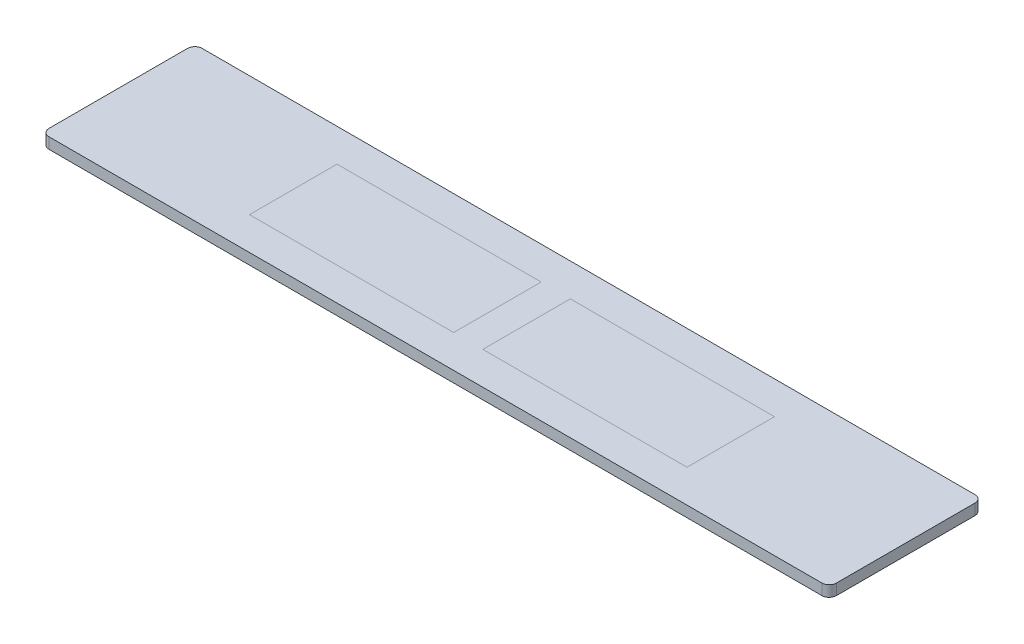
ISO-10303-21;
HEADER;
FILE_DESCRIPTION(('STEP AP214'),'2;1');
FILE_NAME('part.step','',(''),(''),'','','');
FILE_SCHEMA(('AUTOMOTIVE_DESIGN { 1 0 10303 214 1 1 1 1 }'));
ENDSEC;
DATA;
#1=APPLICATION_CONTEXT('core data for automotive mechanical design processes');
#2=APPLICATION_PROTOCOL_DEFINITION('international standard','automotive_design',2000,#1);
#3=PRODUCT_CONTEXT('',#1,'mechanical');
#4=PRODUCT('Part','Part','',(#3));
#5=PRODUCT_RELATED_PRODUCT_CATEGORY('part','',(#4));
#6=PRODUCT_DEFINITION_FORMATION('','',#4);
#7=PRODUCT_DEFINITION_CONTEXT('part definition',#1,'design');
#8=PRODUCT_DEFINITION('design','',#6,#7);
#9=PRODUCT_DEFINITION_SHAPE('','',#8);
#10=(LENGTH_UNIT() NAMED_UNIT(*) SI_UNIT(.MILLI.,.METRE.));
#11=(NAMED_UNIT(*) PLANE_ANGLE_UNIT() SI_UNIT($,.RADIAN.));
#12=(NAMED_UNIT(*) SI_UNIT($,.STERADIAN.) SOLID_ANGLE_UNIT());
#13=UNCERTAINTY_MEASURE_WITH_UNIT(LENGTH_MEASURE(1.E-05),#10,'distance_accuracy_value','');
#14=(GEOMETRIC_REPRESENTATION_CONTEXT(3) GLOBAL_UNCERTAINTY_ASSIGNED_CONTEXT((#13)) GLOBAL_UNIT_ASSIGNED_CONTEXT((#10,
#11,#12)) REPRESENTATION_CONTEXT('',''));
#15=CARTESIAN_POINT('',(0.,0.,0.));
#16=DIRECTION('',(0.,0.,1.));
#17=DIRECTION('',(1.,0.,0.));
#18=AXIS2_PLACEMENT_3D('',#15,#16,#17);
#19=CARTESIAN_POINT('',(0.,4.7625,0.));
#20=DIRECTION('',(0.,-1.,0.));
#21=DIRECTION('',(0.,0.,-1.));
#22=AXIS2_PLACEMENT_3D('',#19,#20,#21);
#23=PLANE('',#22);
#24=DIRECTION('',(0.,0.,-1.));
#25=VECTOR('',#24,1.);
#26=CARTESIAN_POINT('',(190.5,4.7625,0.));
#27=LINE('',#26,#25);
#28=CARTESIAN_POINT('',(190.5,4.7625,38.1));
#29=VERTEX_POINT('',#28);
#30=CARTESIAN_POINT('',(190.5,4.7625,-38.1));
#31=VERTEX_POINT('',#30);
#32=EDGE_CURVE('E204',#29,#31,#27,.T.);
#33=ORIENTED_EDGE('',*,*,#32,.F.);
#34=DIRECTION('',(1.,0.,0.));
#35=VECTOR('',#34,1.);
#36=CARTESIAN_POINT('',(0.,4.7625,38.1));
#37=LINE('',#36,#35);
#38=CARTESIAN_POINT('',(12.6999999999999,4.7625,38.1));
#39=VERTEX_POINT('',#38);
#40=EDGE_CURVE('E194',#39,#29,#37,.T.);
#41=ORIENTED_EDGE('',*,*,#40,.F.);
#42=DIRECTION('',(0.,0.,1.));
#43=VECTOR('',#42,1.);
#44=CARTESIAN_POINT('',(12.6999999999999,4.7625,0.));
#45=LINE('',#44,#43);
#46=CARTESIAN_POINT('',(12.6999999999999,4.7625,-38.1));
#47=VERTEX_POINT('',#46);
#48=EDGE_CURVE('E198',#47,#39,#45,.T.);
#49=ORIENTED_EDGE('',*,*,#48,.F.);
#50=DIRECTION('',(-1.,0.,0.));
#51=VECTOR('',#50,1.);
#52=CARTESIAN_POINT('',(0.,4.7625,-38.1));
#53=LINE('',#52,#51);
#54=EDGE_CURVE('E201',#31,#47,#53,.T.);
#55=ORIENTED_EDGE('',*,*,#54,.F.);
#56=EDGE_LOOP('',(#33,#41,#49,#55));
#57=FACE_BOUND('',#56,.T.);
#58=DIRECTION('',(0.,0.,-1.));
#59=VECTOR('',#58,1.);
#60=CARTESIAN_POINT('',(342.9,4.7625,66.675));
#61=LINE('',#60,#59);
#62=CARTESIAN_POINT('',(342.9,4.7625,60.325));
#63=VERTEX_POINT('',#62);
#64=CARTESIAN_POINT('',(342.9,4.7625,-60.325));
#65=VERTEX_POINT('',#64);
#66=EDGE_CURVE('E138',#63,#65,#61,.T.);
#67=ORIENTED_EDGE('',*,*,#66,.T.);
#68=CARTESIAN_POINT('',(336.55,4.7625,-60.325));
#69=DIRECTION('',(0.,-1.,0.));
#70=DIRECTION('',(0.,0.,-1.));
#71=AXIS2_PLACEMENT_3D('',#68,#69,#70);
#72=CIRCLE('',#71,6.35);
#73=CARTESIAN_POINT('',(336.55,4.7625,-66.675));
#74=VERTEX_POINT('',#73);
#75=EDGE_CURVE('E171',#65,#74,#72,.F.);
#76=ORIENTED_EDGE('',*,*,#75,.T.);
#77=DIRECTION('',(-1.,0.,0.));
#78=VECTOR('',#77,1.);
#79=CARTESIAN_POINT('',(-342.9,4.7625,-66.675));
#80=LINE('',#79,#78);
#81=CARTESIAN_POINT('',(-336.55,4.7625,-66.675));
#82=VERTEX_POINT('',#81);
#83=EDGE_CURVE('E155',#74,#82,#80,.T.);
#84=ORIENTED_EDGE('',*,*,#83,.T.);
#85=CARTESIAN_POINT('',(-336.55,4.7625,-60.325));
#86=DIRECTION('',(0.,-1.,0.));
#87=DIRECTION('',(0.,0.,-1.));
#88=AXIS2_PLACEMENT_3D('',#85,#86,#87);
#89=CIRCLE('',#88,6.35);
#90=CARTESIAN_POINT('',(-342.9,4.7625,-60.325));
#91=VERTEX_POINT('',#90);
#92=EDGE_CURVE('E169',#82,#91,#89,.F.);
#93=ORIENTED_EDGE('',*,*,#92,.T.);
#94=DIRECTION('',(0.,0.,1.));
#95=VECTOR('',#94,1.);
#96=CARTESIAN_POINT('',(-342.9,4.7625,66.675));
#97=LINE('',#96,#95);
#98=CARTESIAN_POINT('',(-342.9,4.7625,60.325));
#99=VERTEX_POINT('',#98);
#100=EDGE_CURVE('E219',#91,#99,#97,.T.);
#101=ORIENTED_EDGE('',*,*,#100,.T.);
#102=CARTESIAN_POINT('',(-336.55,4.7625,60.325));
#103=DIRECTION('',(0.,-1.,0.));
#104=DIRECTION('',(0.,0.,-1.));
#105=AXIS2_PLACEMENT_3D('',#102,#103,#104);
#106=CIRCLE('',#105,6.35);
#107=CARTESIAN_POINT('',(-336.55,4.7625,66.675));
#108=VERTEX_POINT('',#107);
#109=EDGE_CURVE('E145',#99,#108,#106,.F.);
#110=ORIENTED_EDGE('',*,*,#109,.T.);
#111=DIRECTION('',(1.,0.,0.));
#112=VECTOR('',#111,1.);
#113=CARTESIAN_POINT('',(-342.9,4.7625,66.675));
#114=LINE('',#113,#112);
#115=CARTESIAN_POINT('',(336.55,4.7625,66.675));
#116=VERTEX_POINT('',#115);
#117=EDGE_CURVE('E140',#108,#116,#114,.T.);
#118=ORIENTED_EDGE('',*,*,#117,.T.);
#119=CARTESIAN_POINT('',(336.55,4.7625,60.325));
#120=DIRECTION('',(0.,-1.,0.));
#121=DIRECTION('',(0.,0.,-1.));
#122=AXIS2_PLACEMENT_3D('',#119,#120,#121);
#123=CIRCLE('',#122,6.35);
#124=EDGE_CURVE('E135',#116,#63,#123,.F.);
#125=ORIENTED_EDGE('',*,*,#124,.T.);
#126=EDGE_LOOP('',(#67,#76,#84,#93,#101,#110,#118,#125));
#127=FACE_BOUND('',#126,.T.);
#128=DIRECTION('',(0.,0.,-1.));
#129=VECTOR('',#128,1.);
#130=CARTESIAN_POINT('',(-12.6999999999999,4.7625,0.));
#131=LINE('',#130,#129);
#132=CARTESIAN_POINT('',(-12.6999999999999,4.7625,38.1));
#133=VERTEX_POINT('',#132);
#134=CARTESIAN_POINT('',(-12.6999999999999,4.7625,-38.1));
#135=VERTEX_POINT('',#134);
#136=EDGE_CURVE('E11',#133,#135,#131,.T.);
#137=ORIENTED_EDGE('',*,*,#136,.F.);
#138=DIRECTION('',(1.,0.,0.));
#139=VECTOR('',#138,1.);
#140=CARTESIAN_POINT('',(0.,4.7625,38.1));
#141=LINE('',#140,#139);
#142=CARTESIAN_POINT('',(-190.5,4.7625,38.1));
#143=VERTEX_POINT('',#142);
#144=EDGE_CURVE('E207',#143,#133,#141,.T.);
#145=ORIENTED_EDGE('',*,*,#144,.F.);
#146=DIRECTION('',(0.,0.,1.));
#147=VECTOR('',#146,1.);
#148=CARTESIAN_POINT('',(-190.5,4.7625,0.));
#149=LINE('',#148,#147);
#150=CARTESIAN_POINT('',(-190.5,4.7625,-38.1));
#151=VERTEX_POINT('',#150);
#152=EDGE_CURVE('E210',#151,#143,#149,.T.);
#153=ORIENTED_EDGE('',*,*,#152,.F.);
#154=DIRECTION('',(-1.,0.,0.));
#155=VECTOR('',#154,1.);
#156=CARTESIAN_POINT('',(0.,4.7625,-38.1));
#157=LINE('',#156,#155);
#158=EDGE_CURVE('E59',#135,#151,#157,.T.);
#159=ORIENTED_EDGE('',*,*,#158,.F.);
#160=EDGE_LOOP('',(#137,#145,#153,#159));
#161=FACE_BOUND('',#160,.T.);
#162=ADVANCED_FACE('F50',(#57,#127,#161),#23,.F.);
#163=ORIENTED_EDGE('',*,*,#144,.T.);
#164=ORIENTED_EDGE('',*,*,#136,.T.);
#165=ORIENTED_EDGE('',*,*,#158,.T.);
#166=ORIENTED_EDGE('',*,*,#152,.T.);
#167=EDGE_LOOP('',(#163,#164,#165,#166));
#168=FACE_BOUND('',#167,.T.);
#169=ADVANCED_FACE('F266',(#168),#23,.F.);
#170=CARTESIAN_POINT('',(342.9,-4.7625,66.675));
#171=DIRECTION('',(1.,0.,0.));
#172=DIRECTION('',(0.,0.,-1.));
#173=AXIS2_PLACEMENT_3D('',#170,#171,#172);
#174=PLANE('',#173);
#175=DIRECTION('',(0.,0.,-1.));
#176=VECTOR('',#175,1.);
#177=CARTESIAN_POINT('',(342.9,-4.7625,66.675));
#178=LINE('',#177,#176);
#179=CARTESIAN_POINT('',(342.9,-4.7625,60.325));
#180=VERTEX_POINT('',#179);
#181=CARTESIAN_POINT('',(342.9,-4.7625,-60.325));
#182=VERTEX_POINT('',#181);
#183=EDGE_CURVE('E223',#180,#182,#178,.T.);
#184=ORIENTED_EDGE('',*,*,#183,.T.);
#185=DIRECTION('',(0.,1.,0.));
#186=VECTOR('',#185,1.);
#187=CARTESIAN_POINT('',(342.9,-4.7625,-60.325));
#188=LINE('',#187,#186);
#189=EDGE_CURVE('E146',#182,#65,#188,.T.);
#190=ORIENTED_EDGE('',*,*,#189,.T.);
#191=ORIENTED_EDGE('',*,*,#66,.F.);
#192=DIRECTION('',(0.,1.,0.));
#193=VECTOR('',#192,1.);
#194=CARTESIAN_POINT('',(342.9,-4.7625,60.325));
#195=LINE('',#194,#193);
#196=EDGE_CURVE('E152',#63,#180,#195,.F.);
#197=ORIENTED_EDGE('',*,*,#196,.T.);
#198=EDGE_LOOP('',(#184,#190,#191,#197));
#199=FACE_BOUND('',#198,.T.);
#200=ADVANCED_FACE('F151',(#199),#174,.T.);
#201=CARTESIAN_POINT('',(-342.9,-4.7625,66.675));
#202=DIRECTION('',(0.,0.,1.));
#203=DIRECTION('',(1.,0.,0.));
#204=AXIS2_PLACEMENT_3D('',#201,#202,#203);
#205=PLANE('',#204);
#206=ORIENTED_EDGE('',*,*,#117,.F.);
#207=DIRECTION('',(0.,1.,0.));
#208=VECTOR('',#207,1.);
#209=CARTESIAN_POINT('',(-336.55,-4.7625,66.675));
#210=LINE('',#209,#208);
#211=CARTESIAN_POINT('',(-336.55,-4.7625,66.675));
#212=VERTEX_POINT('',#211);
#213=EDGE_CURVE('E192',#108,#212,#210,.F.);
#214=ORIENTED_EDGE('',*,*,#213,.T.);
#215=DIRECTION('',(1.,0.,0.));
#216=VECTOR('',#215,1.);
#217=CARTESIAN_POINT('',(-342.9,-4.7625,66.675));
#218=LINE('',#217,#216);
#219=CARTESIAN_POINT('',(336.55,-4.7625,66.675));
#220=VERTEX_POINT('',#219);
#221=EDGE_CURVE('E159',#212,#220,#218,.T.);
#222=ORIENTED_EDGE('',*,*,#221,.T.);
#223=DIRECTION('',(0.,1.,0.));
#224=VECTOR('',#223,1.);
#225=CARTESIAN_POINT('',(336.55,-4.7625,66.675));
#226=LINE('',#225,#224);
#227=EDGE_CURVE('E190',#220,#116,#226,.T.);
#228=ORIENTED_EDGE('',*,*,#227,.T.);
#229=EDGE_LOOP('',(#206,#214,#222,#228));
#230=FACE_BOUND('',#229,.T.);
#231=ADVANCED_FACE('F250',(#230),#205,.T.);
#232=CARTESIAN_POINT('',(-342.9,-4.7625,66.675));
#233=DIRECTION('',(-1.,0.,0.));
#234=DIRECTION('',(0.,0.,1.));
#235=AXIS2_PLACEMENT_3D('',#232,#233,#234);
#236=PLANE('',#235);
#237=ORIENTED_EDGE('',*,*,#100,.F.);
#238=DIRECTION('',(0.,1.,0.));
#239=VECTOR('',#238,1.);
#240=CARTESIAN_POINT('',(-342.9,-4.7625,-60.325));
#241=LINE('',#240,#239);
#242=CARTESIAN_POINT('',(-342.9,-4.7625,-60.325));
#243=VERTEX_POINT('',#242);
#244=EDGE_CURVE('E188',#91,#243,#241,.F.);
#245=ORIENTED_EDGE('',*,*,#244,.T.);
#246=DIRECTION('',(0.,0.,1.));
#247=VECTOR('',#246,1.);
#248=CARTESIAN_POINT('',(-342.9,-4.7625,66.675));
#249=LINE('',#248,#247);
#250=CARTESIAN_POINT('',(-342.9,-4.7625,60.325));
#251=VERTEX_POINT('',#250);
#252=EDGE_CURVE('E163',#243,#251,#249,.T.);
#253=ORIENTED_EDGE('',*,*,#252,.T.);
#254=DIRECTION('',(0.,1.,0.));
#255=VECTOR('',#254,1.);
#256=CARTESIAN_POINT('',(-342.9,-4.7625,60.325));
#257=LINE('',#256,#255);
#258=EDGE_CURVE('E185',#251,#99,#257,.T.);
#259=ORIENTED_EDGE('',*,*,#258,.T.);
#260=EDGE_LOOP('',(#237,#245,#253,#259));
#261=FACE_BOUND('',#260,.T.);
#262=ADVANCED_FACE('F235',(#261),#236,.T.);
#263=CARTESIAN_POINT('',(-342.9,-4.7625,-66.675));
#264=DIRECTION('',(0.,0.,-1.));
#265=DIRECTION('',(-1.,0.,0.));
#266=AXIS2_PLACEMENT_3D('',#263,#264,#265);
#267=PLANE('',#266);
#268=ORIENTED_EDGE('',*,*,#83,.F.);
#269=DIRECTION('',(0.,1.,0.));
#270=VECTOR('',#269,1.);
#271=CARTESIAN_POINT('',(336.55,-4.7625,-66.675));
#272=LINE('',#271,#270);
#273=CARTESIAN_POINT('',(336.55,-4.7625,-66.675));
#274=VERTEX_POINT('',#273);
#275=EDGE_CURVE('E176',#74,#274,#272,.F.);
#276=ORIENTED_EDGE('',*,*,#275,.T.);
#277=DIRECTION('',(-1.,0.,0.));
#278=VECTOR('',#277,1.);
#279=CARTESIAN_POINT('',(-342.9,-4.7625,-66.675));
#280=LINE('',#279,#278);
#281=CARTESIAN_POINT('',(-336.55,-4.7625,-66.675));
#282=VERTEX_POINT('',#281);
#283=EDGE_CURVE('E221',#274,#282,#280,.T.);
#284=ORIENTED_EDGE('',*,*,#283,.T.);
#285=DIRECTION('',(0.,1.,0.));
#286=VECTOR('',#285,1.);
#287=CARTESIAN_POINT('',(-336.55,-4.7625,-66.675));
#288=LINE('',#287,#286);
#289=EDGE_CURVE('E173',#282,#82,#288,.T.);
#290=ORIENTED_EDGE('',*,*,#289,.T.);
#291=EDGE_LOOP('',(#268,#276,#284,#290));
#292=FACE_BOUND('',#291,.T.);
#293=ADVANCED_FACE('F255',(#292),#267,.T.);
#294=CARTESIAN_POINT('',(0.,-4.7625,0.));
#295=DIRECTION('',(0.,-1.,0.));
#296=DIRECTION('',(0.,0.,-1.));
#297=AXIS2_PLACEMENT_3D('',#294,#295,#296);
#298=PLANE('',#297);
#299=ORIENTED_EDGE('',*,*,#283,.F.);
#300=CARTESIAN_POINT('',(336.55,-4.7625,-60.325));
#301=DIRECTION('',(0.,-1.,0.));
#302=DIRECTION('',(0.,0.,-1.));
#303=AXIS2_PLACEMENT_3D('',#300,#301,#302);
#304=CIRCLE('',#303,6.35);
#305=EDGE_CURVE('E183',#274,#182,#304,.T.);
#306=ORIENTED_EDGE('',*,*,#305,.T.);
#307=ORIENTED_EDGE('',*,*,#183,.F.);
#308=CARTESIAN_POINT('',(336.55,-4.7625,60.325));
#309=DIRECTION('',(0.,-1.,0.));
#310=DIRECTION('',(0.,0.,-1.));
#311=AXIS2_PLACEMENT_3D('',#308,#309,#310);
#312=CIRCLE('',#311,6.35);
#313=EDGE_CURVE('E158',#180,#220,#312,.T.);
#314=ORIENTED_EDGE('',*,*,#313,.T.);
#315=ORIENTED_EDGE('',*,*,#221,.F.);
#316=CARTESIAN_POINT('',(-336.55,-4.7625,60.325));
#317=DIRECTION('',(0.,-1.,0.));
#318=DIRECTION('',(0.,0.,-1.));
#319=AXIS2_PLACEMENT_3D('',#316,#317,#318);
#320=CIRCLE('',#319,6.35);
#321=EDGE_CURVE('E179',#212,#251,#320,.T.);
#322=ORIENTED_EDGE('',*,*,#321,.T.);
#323=ORIENTED_EDGE('',*,*,#252,.F.);
#324=CARTESIAN_POINT('',(-336.55,-4.7625,-60.325));
#325=DIRECTION('',(0.,-1.,0.));
#326=DIRECTION('',(0.,0.,-1.));
#327=AXIS2_PLACEMENT_3D('',#324,#325,#326);
#328=CIRCLE('',#327,6.35);
#329=EDGE_CURVE('E181',#243,#282,#328,.T.);
#330=ORIENTED_EDGE('',*,*,#329,.T.);
#331=EDGE_LOOP('',(#299,#306,#307,#314,#315,#322,#323,#330));
#332=FACE_BOUND('',#331,.T.);
#333=ADVANCED_FACE('F242',(#332),#298,.T.);
#334=ORIENTED_EDGE('',*,*,#40,.T.);
#335=ORIENTED_EDGE('',*,*,#32,.T.);
#336=ORIENTED_EDGE('',*,*,#54,.T.);
#337=ORIENTED_EDGE('',*,*,#48,.T.);
#338=EDGE_LOOP('',(#334,#335,#336,#337));
#339=FACE_BOUND('',#338,.T.);
#340=ADVANCED_FACE('F261',(#339),#23,.F.);
#341=CARTESIAN_POINT('',(336.55,-4.7625,-60.325));
#342=DIRECTION('',(0.,1.,0.));
#343=DIRECTION('',(0.,0.,1.));
#344=AXIS2_PLACEMENT_3D('',#341,#342,#343);
#345=CYLINDRICAL_SURFACE('',#344,6.35);
#346=ORIENTED_EDGE('',*,*,#305,.F.);
#347=ORIENTED_EDGE('',*,*,#275,.F.);
#348=ORIENTED_EDGE('',*,*,#75,.F.);
#349=ORIENTED_EDGE('',*,*,#189,.F.);
#350=EDGE_LOOP('',(#346,#347,#348,#349));
#351=FACE_BOUND('',#350,.T.);
#352=ADVANCED_FACE('F252',(#351),#345,.T.);
#353=CARTESIAN_POINT('',(-336.55,-4.7625,-60.325));
#354=DIRECTION('',(0.,1.,0.));
#355=DIRECTION('',(0.,0.,1.));
#356=AXIS2_PLACEMENT_3D('',#353,#354,#355);
#357=CYLINDRICAL_SURFACE('',#356,6.35);
#358=ORIENTED_EDGE('',*,*,#329,.F.);
#359=ORIENTED_EDGE('',*,*,#244,.F.);
#360=ORIENTED_EDGE('',*,*,#92,.F.);
#361=ORIENTED_EDGE('',*,*,#289,.F.);
#362=EDGE_LOOP('',(#358,#359,#360,#361));
#363=FACE_BOUND('',#362,.T.);
#364=ADVANCED_FACE('F240',(#363),#357,.T.);
#365=CARTESIAN_POINT('',(-336.55,-4.7625,60.325));
#366=DIRECTION('',(0.,1.,0.));
#367=DIRECTION('',(0.,0.,1.));
#368=AXIS2_PLACEMENT_3D('',#365,#366,#367);
#369=CYLINDRICAL_SURFACE('',#368,6.35);
#370=ORIENTED_EDGE('',*,*,#321,.F.);
#371=ORIENTED_EDGE('',*,*,#213,.F.);
#372=ORIENTED_EDGE('',*,*,#109,.F.);
#373=ORIENTED_EDGE('',*,*,#258,.F.);
#374=EDGE_LOOP('',(#370,#371,#372,#373));
#375=FACE_BOUND('',#374,.T.);
#376=ADVANCED_FACE('F247',(#375),#369,.T.);
#377=CARTESIAN_POINT('',(336.55,-4.7625,60.325));
#378=DIRECTION('',(0.,1.,0.));
#379=DIRECTION('',(0.,0.,1.));
#380=AXIS2_PLACEMENT_3D('',#377,#378,#379);
#381=CYLINDRICAL_SURFACE('',#380,6.35);
#382=ORIENTED_EDGE('',*,*,#313,.F.);
#383=ORIENTED_EDGE('',*,*,#196,.F.);
#384=ORIENTED_EDGE('',*,*,#124,.F.);
#385=ORIENTED_EDGE('',*,*,#227,.F.);
#386=EDGE_LOOP('',(#382,#383,#384,#385));
#387=FACE_BOUND('',#386,.T.);
#388=ADVANCED_FACE('F52',(#387),#381,.T.);
#389=CLOSED_SHELL('',(#162,#169,#200,#231,#262,#293,#333,#340,#352,#364,#376,#388));
#390=MANIFOLD_SOLID_BREP('B2',#389);
#391=ADVANCED_BREP_SHAPE_REPRESENTATION('',(#18,#390),#14);
#392=SHAPE_DEFINITION_REPRESENTATION(#9,#391);
ENDSEC;
END-ISO-10303-21;
